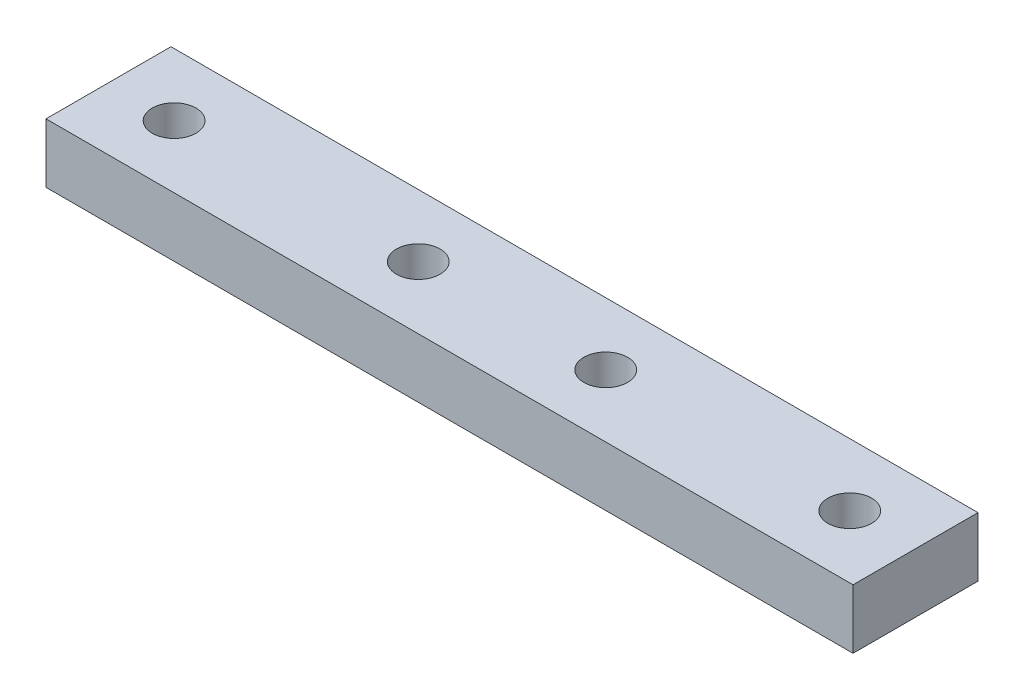
ISO-10303-21;
HEADER;
FILE_DESCRIPTION(('STEP AP214'),'2;1');
FILE_NAME('part.step','',(''),(''),'','','');
FILE_SCHEMA(('AUTOMOTIVE_DESIGN { 1 0 10303 214 1 1 1 1 }'));
ENDSEC;
DATA;
#1=APPLICATION_CONTEXT('core data for automotive mechanical design processes');
#2=APPLICATION_PROTOCOL_DEFINITION('international standard','automotive_design',2000,#1);
#3=PRODUCT_CONTEXT('',#1,'mechanical');
#4=PRODUCT('Part','Part','',(#3));
#5=PRODUCT_RELATED_PRODUCT_CATEGORY('part','',(#4));
#6=PRODUCT_DEFINITION_FORMATION('','',#4);
#7=PRODUCT_DEFINITION_CONTEXT('part definition',#1,'design');
#8=PRODUCT_DEFINITION('design','',#6,#7);
#9=PRODUCT_DEFINITION_SHAPE('','',#8);
#10=(LENGTH_UNIT() NAMED_UNIT(*) SI_UNIT(.MILLI.,.METRE.));
#11=(NAMED_UNIT(*) PLANE_ANGLE_UNIT() SI_UNIT($,.RADIAN.));
#12=(NAMED_UNIT(*) SI_UNIT($,.STERADIAN.) SOLID_ANGLE_UNIT());
#13=UNCERTAINTY_MEASURE_WITH_UNIT(LENGTH_MEASURE(1.E-05),#10,'distance_accuracy_value','');
#14=(GEOMETRIC_REPRESENTATION_CONTEXT(3) GLOBAL_UNCERTAINTY_ASSIGNED_CONTEXT((#13)) GLOBAL_UNIT_ASSIGNED_CONTEXT((#10,
#11,#12)) REPRESENTATION_CONTEXT('',''));
#15=CARTESIAN_POINT('',(0.,0.,0.));
#16=DIRECTION('',(0.,0.,1.));
#17=DIRECTION('',(1.,0.,0.));
#18=AXIS2_PLACEMENT_3D('',#15,#16,#17);
#19=CARTESIAN_POINT('',(-32.29,4.75,-5.));
#20=DIRECTION('',(1.,0.,0.));
#21=DIRECTION('',(0.,0.,-1.));
#22=AXIS2_PLACEMENT_3D('',#19,#20,#21);
#23=PLANE('',#22);
#24=DIRECTION('',(0.,0.,1.));
#25=VECTOR('',#24,1.);
#26=CARTESIAN_POINT('',(-32.29,0.,-5.));
#27=LINE('',#26,#25);
#28=CARTESIAN_POINT('',(-32.29,0.,-5.));
#29=VERTEX_POINT('',#28);
#30=CARTESIAN_POINT('',(-32.29,0.,5.));
#31=VERTEX_POINT('',#30);
#32=EDGE_CURVE('E119',#29,#31,#27,.T.);
#33=ORIENTED_EDGE('',*,*,#32,.T.);
#34=DIRECTION('',(0.,-1.,0.));
#35=VECTOR('',#34,1.);
#36=CARTESIAN_POINT('',(-32.29,4.75,5.));
#37=LINE('',#36,#35);
#38=CARTESIAN_POINT('',(-32.29,4.75,5.));
#39=VERTEX_POINT('',#38);
#40=EDGE_CURVE('E13',#39,#31,#37,.T.);
#41=ORIENTED_EDGE('',*,*,#40,.F.);
#42=DIRECTION('',(0.,0.,1.));
#43=VECTOR('',#42,1.);
#44=CARTESIAN_POINT('',(-32.29,4.75,-5.));
#45=LINE('',#44,#43);
#46=CARTESIAN_POINT('',(-32.29,4.75,-5.));
#47=VERTEX_POINT('',#46);
#48=EDGE_CURVE('E103',#47,#39,#45,.T.);
#49=ORIENTED_EDGE('',*,*,#48,.F.);
#50=DIRECTION('',(0.,-1.,0.));
#51=VECTOR('',#50,1.);
#52=CARTESIAN_POINT('',(-32.29,4.75,-5.));
#53=LINE('',#52,#51);
#54=EDGE_CURVE('E115',#47,#29,#53,.T.);
#55=ORIENTED_EDGE('',*,*,#54,.T.);
#56=EDGE_LOOP('',(#33,#41,#49,#55));
#57=FACE_BOUND('',#56,.T.);
#58=ADVANCED_FACE('F51',(#57),#23,.F.);
#59=CARTESIAN_POINT('',(-32.29,4.75,5.));
#60=DIRECTION('',(0.,0.,-1.));
#61=DIRECTION('',(-1.,0.,0.));
#62=AXIS2_PLACEMENT_3D('',#59,#60,#61);
#63=PLANE('',#62);
#64=DIRECTION('',(1.,0.,0.));
#65=VECTOR('',#64,1.);
#66=CARTESIAN_POINT('',(-32.29,0.,5.));
#67=LINE('',#66,#65);
#68=CARTESIAN_POINT('',(32.29,0.,5.));
#69=VERTEX_POINT('',#68);
#70=EDGE_CURVE('E108',#31,#69,#67,.T.);
#71=ORIENTED_EDGE('',*,*,#70,.T.);
#72=DIRECTION('',(0.,-1.,0.));
#73=VECTOR('',#72,1.);
#74=CARTESIAN_POINT('',(32.29,4.75,5.));
#75=LINE('',#74,#73);
#76=CARTESIAN_POINT('',(32.29,4.75,5.));
#77=VERTEX_POINT('',#76);
#78=EDGE_CURVE('E60',#77,#69,#75,.T.);
#79=ORIENTED_EDGE('',*,*,#78,.F.);
#80=DIRECTION('',(1.,0.,0.));
#81=VECTOR('',#80,1.);
#82=CARTESIAN_POINT('',(-32.29,4.75,5.));
#83=LINE('',#82,#81);
#84=EDGE_CURVE('E98',#39,#77,#83,.T.);
#85=ORIENTED_EDGE('',*,*,#84,.F.);
#86=ORIENTED_EDGE('',*,*,#40,.T.);
#87=EDGE_LOOP('',(#71,#79,#85,#86));
#88=FACE_BOUND('',#87,.T.);
#89=ADVANCED_FACE('F107',(#88),#63,.F.);
#90=CARTESIAN_POINT('',(32.29,4.75,-5.));
#91=DIRECTION('',(-1.,0.,0.));
#92=DIRECTION('',(0.,0.,1.));
#93=AXIS2_PLACEMENT_3D('',#90,#91,#92);
#94=PLANE('',#93);
#95=DIRECTION('',(0.,0.,-1.));
#96=VECTOR('',#95,1.);
#97=CARTESIAN_POINT('',(32.29,0.,-5.));
#98=LINE('',#97,#96);
#99=CARTESIAN_POINT('',(32.29,0.,-5.));
#100=VERTEX_POINT('',#99);
#101=EDGE_CURVE('E85',#69,#100,#98,.T.);
#102=ORIENTED_EDGE('',*,*,#101,.T.);
#103=DIRECTION('',(0.,-1.,0.));
#104=VECTOR('',#103,1.);
#105=CARTESIAN_POINT('',(32.29,4.75,-5.));
#106=LINE('',#105,#104);
#107=CARTESIAN_POINT('',(32.29,4.75,-5.));
#108=VERTEX_POINT('',#107);
#109=EDGE_CURVE('E110',#108,#100,#106,.T.);
#110=ORIENTED_EDGE('',*,*,#109,.F.);
#111=DIRECTION('',(0.,0.,-1.));
#112=VECTOR('',#111,1.);
#113=CARTESIAN_POINT('',(32.29,4.75,-5.));
#114=LINE('',#113,#112);
#115=EDGE_CURVE('E101',#77,#108,#114,.T.);
#116=ORIENTED_EDGE('',*,*,#115,.F.);
#117=ORIENTED_EDGE('',*,*,#78,.T.);
#118=EDGE_LOOP('',(#102,#110,#116,#117));
#119=FACE_BOUND('',#118,.T.);
#120=ADVANCED_FACE('F111',(#119),#94,.F.);
#121=CARTESIAN_POINT('',(-32.29,4.75,-5.));
#122=DIRECTION('',(0.,0.,1.));
#123=DIRECTION('',(1.,0.,0.));
#124=AXIS2_PLACEMENT_3D('',#121,#122,#123);
#125=PLANE('',#124);
#126=DIRECTION('',(-1.,0.,0.));
#127=VECTOR('',#126,1.);
#128=CARTESIAN_POINT('',(-32.29,0.,-5.));
#129=LINE('',#128,#127);
#130=EDGE_CURVE('E91',#100,#29,#129,.T.);
#131=ORIENTED_EDGE('',*,*,#130,.T.);
#132=ORIENTED_EDGE('',*,*,#54,.F.);
#133=DIRECTION('',(-1.,0.,0.));
#134=VECTOR('',#133,1.);
#135=CARTESIAN_POINT('',(-32.29,4.75,-5.));
#136=LINE('',#135,#134);
#137=EDGE_CURVE('E68',#108,#47,#136,.T.);
#138=ORIENTED_EDGE('',*,*,#137,.F.);
#139=ORIENTED_EDGE('',*,*,#109,.T.);
#140=EDGE_LOOP('',(#131,#132,#138,#139));
#141=FACE_BOUND('',#140,.T.);
#142=ADVANCED_FACE('F133',(#141),#125,.F.);
#143=CARTESIAN_POINT('',(0.,4.75,0.));
#144=DIRECTION('',(0.,1.,0.));
#145=DIRECTION('',(0.,0.,1.));
#146=AXIS2_PLACEMENT_3D('',#143,#144,#145);
#147=PLANE('',#146);
#148=CARTESIAN_POINT('',(-27.0395,4.75,0.));
#149=DIRECTION('',(0.,1.,0.));
#150=DIRECTION('',(0.,0.,1.));
#151=AXIS2_PLACEMENT_3D('',#148,#149,#150);
#152=CIRCLE('',#151,1.75);
#153=CARTESIAN_POINT('',(-27.0395,4.75,1.75));
#154=VERTEX_POINT('',#153);
#155=EDGE_CURVE('E164',#154,#154,#152,.T.);
#156=ORIENTED_EDGE('',*,*,#155,.F.);
#157=EDGE_LOOP('',(#156));
#158=FACE_BOUND('',#157,.T.);
#159=CARTESIAN_POINT('',(27.0305,4.75,0.));
#160=DIRECTION('',(0.,1.,0.));
#161=DIRECTION('',(0.,0.,1.));
#162=AXIS2_PLACEMENT_3D('',#159,#160,#161);
#163=CIRCLE('',#162,1.75);
#164=CARTESIAN_POINT('',(27.0305,4.75,1.75));
#165=VERTEX_POINT('',#164);
#166=EDGE_CURVE('E156',#165,#165,#163,.T.);
#167=ORIENTED_EDGE('',*,*,#166,.F.);
#168=EDGE_LOOP('',(#167));
#169=FACE_BOUND('',#168,.T.);
#170=CARTESIAN_POINT('',(7.5,4.75,0.));
#171=DIRECTION('',(0.,1.,0.));
#172=DIRECTION('',(0.,0.,1.));
#173=AXIS2_PLACEMENT_3D('',#170,#171,#172);
#174=CIRCLE('',#173,1.75);
#175=CARTESIAN_POINT('',(7.5,4.75,1.75));
#176=VERTEX_POINT('',#175);
#177=EDGE_CURVE('E148',#176,#176,#174,.T.);
#178=ORIENTED_EDGE('',*,*,#177,.F.);
#179=EDGE_LOOP('',(#178));
#180=FACE_BOUND('',#179,.T.);
#181=CARTESIAN_POINT('',(-7.5,4.75,0.));
#182=DIRECTION('',(0.,1.,0.));
#183=DIRECTION('',(0.,0.,1.));
#184=AXIS2_PLACEMENT_3D('',#181,#182,#183);
#185=CIRCLE('',#184,1.75);
#186=CARTESIAN_POINT('',(-7.5,4.75,1.75));
#187=VERTEX_POINT('',#186);
#188=EDGE_CURVE('E140',#187,#187,#185,.T.);
#189=ORIENTED_EDGE('',*,*,#188,.F.);
#190=EDGE_LOOP('',(#189));
#191=FACE_BOUND('',#190,.T.);
#192=ORIENTED_EDGE('',*,*,#48,.T.);
#193=ORIENTED_EDGE('',*,*,#84,.T.);
#194=ORIENTED_EDGE('',*,*,#115,.T.);
#195=ORIENTED_EDGE('',*,*,#137,.T.);
#196=EDGE_LOOP('',(#192,#193,#194,#195));
#197=FACE_BOUND('',#196,.T.);
#198=ADVANCED_FACE('F99',(#158,#169,#180,#191,#197),#147,.T.);
#199=CARTESIAN_POINT('',(0.,0.,0.));
#200=DIRECTION('',(0.,1.,0.));
#201=DIRECTION('',(0.,0.,1.));
#202=AXIS2_PLACEMENT_3D('',#199,#200,#201);
#203=PLANE('',#202);
#204=CARTESIAN_POINT('',(-27.0395,0.,0.));
#205=DIRECTION('',(0.,1.,0.));
#206=DIRECTION('',(0.,0.,1.));
#207=AXIS2_PLACEMENT_3D('',#204,#205,#206);
#208=CIRCLE('',#207,1.75);
#209=CARTESIAN_POINT('',(-27.0395,0.,1.75));
#210=VERTEX_POINT('',#209);
#211=EDGE_CURVE('E123',#210,#210,#208,.T.);
#212=ORIENTED_EDGE('',*,*,#211,.T.);
#213=EDGE_LOOP('',(#212));
#214=FACE_BOUND('',#213,.T.);
#215=CARTESIAN_POINT('',(27.0305,0.,0.));
#216=DIRECTION('',(0.,1.,0.));
#217=DIRECTION('',(0.,0.,1.));
#218=AXIS2_PLACEMENT_3D('',#215,#216,#217);
#219=CIRCLE('',#218,1.75);
#220=CARTESIAN_POINT('',(27.0305,0.,1.75));
#221=VERTEX_POINT('',#220);
#222=EDGE_CURVE('E160',#221,#221,#219,.T.);
#223=ORIENTED_EDGE('',*,*,#222,.T.);
#224=EDGE_LOOP('',(#223));
#225=FACE_BOUND('',#224,.T.);
#226=CARTESIAN_POINT('',(7.5,0.,0.));
#227=DIRECTION('',(0.,1.,0.));
#228=DIRECTION('',(0.,0.,1.));
#229=AXIS2_PLACEMENT_3D('',#226,#227,#228);
#230=CIRCLE('',#229,1.75);
#231=CARTESIAN_POINT('',(7.5,0.,1.75));
#232=VERTEX_POINT('',#231);
#233=EDGE_CURVE('E152',#232,#232,#230,.T.);
#234=ORIENTED_EDGE('',*,*,#233,.T.);
#235=EDGE_LOOP('',(#234));
#236=FACE_BOUND('',#235,.T.);
#237=CARTESIAN_POINT('',(-7.5,0.,0.));
#238=DIRECTION('',(0.,1.,0.));
#239=DIRECTION('',(0.,0.,1.));
#240=AXIS2_PLACEMENT_3D('',#237,#238,#239);
#241=CIRCLE('',#240,1.75);
#242=CARTESIAN_POINT('',(-7.5,0.,1.75));
#243=VERTEX_POINT('',#242);
#244=EDGE_CURVE('E144',#243,#243,#241,.T.);
#245=ORIENTED_EDGE('',*,*,#244,.T.);
#246=EDGE_LOOP('',(#245));
#247=FACE_BOUND('',#246,.T.);
#248=ORIENTED_EDGE('',*,*,#32,.F.);
#249=ORIENTED_EDGE('',*,*,#130,.F.);
#250=ORIENTED_EDGE('',*,*,#101,.F.);
#251=ORIENTED_EDGE('',*,*,#70,.F.);
#252=EDGE_LOOP('',(#248,#249,#250,#251));
#253=FACE_BOUND('',#252,.T.);
#254=ADVANCED_FACE('F136',(#214,#225,#236,#247,#253),#203,.F.);
#255=CARTESIAN_POINT('',(-7.5,0.,0.));
#256=DIRECTION('',(0.,1.,0.));
#257=DIRECTION('',(0.,0.,1.));
#258=AXIS2_PLACEMENT_3D('',#255,#256,#257);
#259=CYLINDRICAL_SURFACE('',#258,1.75);
#260=ORIENTED_EDGE('',*,*,#244,.F.);
#261=EDGE_LOOP('',(#260));
#262=FACE_BOUND('',#261,.T.);
#263=ORIENTED_EDGE('',*,*,#188,.T.);
#264=EDGE_LOOP('',(#263));
#265=FACE_BOUND('',#264,.T.);
#266=ADVANCED_FACE('F190',(#262,#265),#259,.F.);
#267=CARTESIAN_POINT('',(7.5,0.,0.));
#268=DIRECTION('',(0.,1.,0.));
#269=DIRECTION('',(0.,0.,1.));
#270=AXIS2_PLACEMENT_3D('',#267,#268,#269);
#271=CYLINDRICAL_SURFACE('',#270,1.75);
#272=ORIENTED_EDGE('',*,*,#233,.F.);
#273=EDGE_LOOP('',(#272));
#274=FACE_BOUND('',#273,.T.);
#275=ORIENTED_EDGE('',*,*,#177,.T.);
#276=EDGE_LOOP('',(#275));
#277=FACE_BOUND('',#276,.T.);
#278=ADVANCED_FACE('F192',(#274,#277),#271,.F.);
#279=CARTESIAN_POINT('',(27.0305,0.,0.));
#280=DIRECTION('',(0.,1.,0.));
#281=DIRECTION('',(0.,0.,1.));
#282=AXIS2_PLACEMENT_3D('',#279,#280,#281);
#283=CYLINDRICAL_SURFACE('',#282,1.75);
#284=ORIENTED_EDGE('',*,*,#222,.F.);
#285=EDGE_LOOP('',(#284));
#286=FACE_BOUND('',#285,.T.);
#287=ORIENTED_EDGE('',*,*,#166,.T.);
#288=EDGE_LOOP('',(#287));
#289=FACE_BOUND('',#288,.T.);
#290=ADVANCED_FACE('F177',(#286,#289),#283,.F.);
#291=CARTESIAN_POINT('',(-27.0395,0.,0.));
#292=DIRECTION('',(0.,1.,0.));
#293=DIRECTION('',(0.,0.,1.));
#294=AXIS2_PLACEMENT_3D('',#291,#292,#293);
#295=CYLINDRICAL_SURFACE('',#294,1.75);
#296=ORIENTED_EDGE('',*,*,#211,.F.);
#297=EDGE_LOOP('',(#296));
#298=FACE_BOUND('',#297,.T.);
#299=ORIENTED_EDGE('',*,*,#155,.T.);
#300=EDGE_LOOP('',(#299));
#301=FACE_BOUND('',#300,.T.);
#302=ADVANCED_FACE('F174',(#298,#301),#295,.F.);
#303=CLOSED_SHELL('',(#58,#89,#120,#142,#198,#254,#266,#278,#290,#302));
#304=MANIFOLD_SOLID_BREP('B2',#303);
#305=ADVANCED_BREP_SHAPE_REPRESENTATION('',(#18,#304),#14);
#306=SHAPE_DEFINITION_REPRESENTATION(#9,#305);
ENDSEC;
END-ISO-10303-21;
